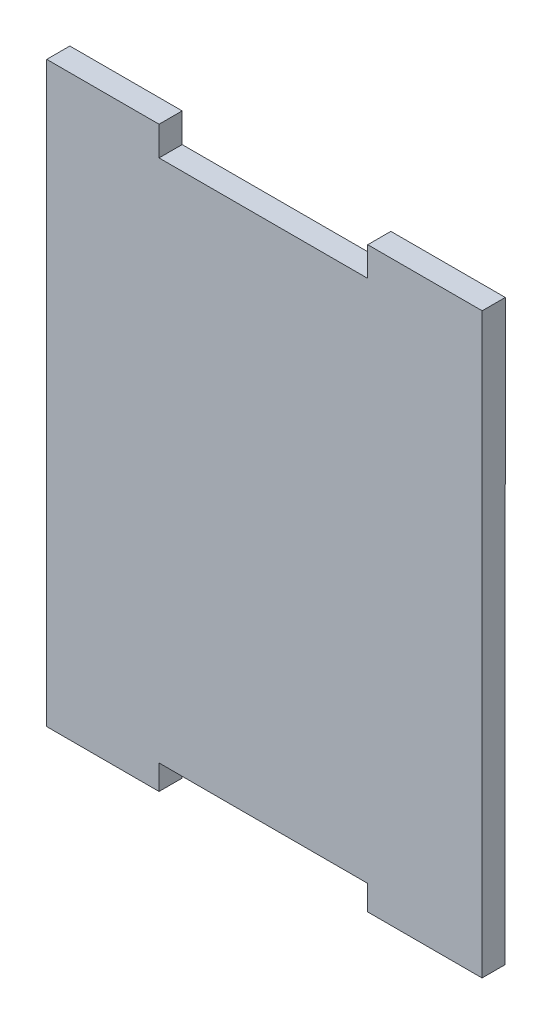
ISO-10303-21;
HEADER;
FILE_DESCRIPTION(('STEP AP214'),'2;1');
FILE_NAME('part.step','',(''),(''),'','','');
FILE_SCHEMA(('AUTOMOTIVE_DESIGN { 1 0 10303 214 1 1 1 1 }'));
ENDSEC;
DATA;
#1=APPLICATION_CONTEXT('core data for automotive mechanical design processes');
#2=APPLICATION_PROTOCOL_DEFINITION('international standard','automotive_design',2000,#1);
#3=PRODUCT_CONTEXT('',#1,'mechanical');
#4=PRODUCT('Part','Part','',(#3));
#5=PRODUCT_RELATED_PRODUCT_CATEGORY('part','',(#4));
#6=PRODUCT_DEFINITION_FORMATION('','',#4);
#7=PRODUCT_DEFINITION_CONTEXT('part definition',#1,'design');
#8=PRODUCT_DEFINITION('design','',#6,#7);
#9=PRODUCT_DEFINITION_SHAPE('','',#8);
#10=(LENGTH_UNIT() NAMED_UNIT(*) SI_UNIT(.MILLI.,.METRE.));
#11=(NAMED_UNIT(*) PLANE_ANGLE_UNIT() SI_UNIT($,.RADIAN.));
#12=(NAMED_UNIT(*) SI_UNIT($,.STERADIAN.) SOLID_ANGLE_UNIT());
#13=UNCERTAINTY_MEASURE_WITH_UNIT(LENGTH_MEASURE(1.E-05),#10,'distance_accuracy_value','');
#14=(GEOMETRIC_REPRESENTATION_CONTEXT(3) GLOBAL_UNCERTAINTY_ASSIGNED_CONTEXT((#13)) GLOBAL_UNIT_ASSIGNED_CONTEXT((#10,
#11,#12)) REPRESENTATION_CONTEXT('',''));
#15=CARTESIAN_POINT('',(0.,0.,0.));
#16=DIRECTION('',(0.,0.,1.));
#17=DIRECTION('',(1.,0.,0.));
#18=AXIS2_PLACEMENT_3D('',#15,#16,#17);
#19=CARTESIAN_POINT('',(286.293052740377,175.473191516554,3.));
#20=DIRECTION('',(1.,0.,0.));
#21=DIRECTION('',(0.,0.,-1.));
#22=AXIS2_PLACEMENT_3D('',#19,#20,#21);
#23=PLANE('',#22);
#24=DIRECTION('',(0.,-1.,0.));
#25=VECTOR('',#24,1.);
#26=CARTESIAN_POINT('',(286.293052740377,175.473191516554,0.));
#27=LINE('',#26,#25);
#28=CARTESIAN_POINT('',(286.293052740377,175.473191516554,0.));
#29=VERTEX_POINT('',#28);
#30=CARTESIAN_POINT('',(286.293052740377,100.473191220008,0.));
#31=VERTEX_POINT('',#30);
#32=EDGE_CURVE('E165',#29,#31,#27,.T.);
#33=ORIENTED_EDGE('',*,*,#32,.T.);
#34=DIRECTION('',(0.,0.,-1.));
#35=VECTOR('',#34,1.);
#36=CARTESIAN_POINT('',(286.293052740377,100.473191220008,3.));
#37=LINE('',#36,#35);
#38=CARTESIAN_POINT('',(286.293052740377,100.473191220008,3.));
#39=VERTEX_POINT('',#38);
#40=EDGE_CURVE('E11',#39,#31,#37,.T.);
#41=ORIENTED_EDGE('',*,*,#40,.F.);
#42=DIRECTION('',(0.,-1.,0.));
#43=VECTOR('',#42,1.);
#44=CARTESIAN_POINT('',(286.293052740377,175.473191516554,3.));
#45=LINE('',#44,#43);
#46=CARTESIAN_POINT('',(286.293052740377,175.473191516554,3.));
#47=VERTEX_POINT('',#46);
#48=EDGE_CURVE('E107',#47,#39,#45,.T.);
#49=ORIENTED_EDGE('',*,*,#48,.F.);
#50=DIRECTION('',(0.,0.,-1.));
#51=VECTOR('',#50,1.);
#52=CARTESIAN_POINT('',(286.293052740377,175.473191516554,3.));
#53=LINE('',#52,#51);
#54=EDGE_CURVE('E58',#47,#29,#53,.T.);
#55=ORIENTED_EDGE('',*,*,#54,.T.);
#56=EDGE_LOOP('',(#33,#41,#49,#55));
#57=FACE_BOUND('',#56,.T.);
#58=ADVANCED_FACE('F41',(#57),#23,.F.);
#59=CARTESIAN_POINT('',(300.871605208173,100.471894803693,3.));
#60=DIRECTION('',(-8.8926271188339E-05,-0.999999996046059,0.));
#61=DIRECTION('',(0.999999996046059,-8.8926271188339E-05,0.));
#62=AXIS2_PLACEMENT_3D('',#59,#60,#61);
#63=PLANE('',#62);
#64=DIRECTION('',(-0.999999996046059,8.8926271188339E-05,0.));
#65=VECTOR('',#64,1.);
#66=CARTESIAN_POINT('',(300.871605208173,100.471894803693,0.));
#67=LINE('',#66,#65);
#68=CARTESIAN_POINT('',(300.871605208173,100.471894803693,0.));
#69=VERTEX_POINT('',#68);
#70=EDGE_CURVE('E168',#69,#31,#67,.T.);
#71=ORIENTED_EDGE('',*,*,#70,.F.);
#72=DIRECTION('',(0.,0.,-1.));
#73=VECTOR('',#72,1.);
#74=CARTESIAN_POINT('',(300.871605208173,100.471894803693,3.));
#75=LINE('',#74,#73);
#76=CARTESIAN_POINT('',(300.871605208173,100.471894803693,3.));
#77=VERTEX_POINT('',#76);
#78=EDGE_CURVE('E50',#77,#69,#75,.T.);
#79=ORIENTED_EDGE('',*,*,#78,.F.);
#80=DIRECTION('',(-0.999999996046059,8.8926271188339E-05,0.));
#81=VECTOR('',#80,1.);
#82=CARTESIAN_POINT('',(300.871605208173,100.471894803693,3.));
#83=LINE('',#82,#81);
#84=EDGE_CURVE('E254',#77,#39,#83,.T.);
#85=ORIENTED_EDGE('',*,*,#84,.T.);
#86=ORIENTED_EDGE('',*,*,#40,.T.);
#87=EDGE_LOOP('',(#71,#79,#85,#86));
#88=FACE_BOUND('',#87,.T.);
#89=ADVANCED_FACE('F242',(#88),#63,.T.);
#90=CARTESIAN_POINT('',(300.872358522715,103.681894958134,3.));
#91=DIRECTION('',(0.999999972463256,-0.000234677409841452,0.));
#92=DIRECTION('',(0.000234677409841452,0.999999972463256,0.));
#93=AXIS2_PLACEMENT_3D('',#90,#91,#92);
#94=PLANE('',#93);
#95=DIRECTION('',(-0.000234677409841452,-0.999999972463256,0.));
#96=VECTOR('',#95,1.);
#97=CARTESIAN_POINT('',(300.872358522715,103.681894958134,0.));
#98=LINE('',#97,#96);
#99=CARTESIAN_POINT('',(300.872358522715,103.681894958134,0.));
#100=VERTEX_POINT('',#99);
#101=EDGE_CURVE('E172',#100,#69,#98,.T.);
#102=ORIENTED_EDGE('',*,*,#101,.F.);
#103=DIRECTION('',(0.,0.,-1.));
#104=VECTOR('',#103,1.);
#105=CARTESIAN_POINT('',(300.872358522715,103.681894958134,3.));
#106=LINE('',#105,#104);
#107=CARTESIAN_POINT('',(300.872358522715,103.681894958134,3.));
#108=VERTEX_POINT('',#107);
#109=EDGE_CURVE('E230',#108,#100,#106,.T.);
#110=ORIENTED_EDGE('',*,*,#109,.F.);
#111=DIRECTION('',(-0.000234677409841452,-0.999999972463256,0.));
#112=VECTOR('',#111,1.);
#113=CARTESIAN_POINT('',(300.872358522715,103.681894958134,3.));
#114=LINE('',#113,#112);
#115=EDGE_CURVE('E239',#108,#77,#114,.T.);
#116=ORIENTED_EDGE('',*,*,#115,.T.);
#117=ORIENTED_EDGE('',*,*,#78,.T.);
#118=EDGE_LOOP('',(#102,#110,#116,#117));
#119=FACE_BOUND('',#118,.T.);
#120=ADVANCED_FACE('F237',(#119),#94,.T.);
#121=CARTESIAN_POINT('',(327.943980392191,103.681896334188,3.));
#122=DIRECTION('',(5.08301229497291E-08,-0.999999999999999,0.));
#123=DIRECTION('',(0.999999999999999,5.08301229497292E-08,0.));
#124=AXIS2_PLACEMENT_3D('',#121,#122,#123);
#125=PLANE('',#124);
#126=DIRECTION('',(-0.999999999999999,-5.08301229497292E-08,0.));
#127=VECTOR('',#126,1.);
#128=CARTESIAN_POINT('',(327.943980392191,103.681896334188,0.));
#129=LINE('',#128,#127);
#130=CARTESIAN_POINT('',(327.943980392191,103.681896334188,0.));
#131=VERTEX_POINT('',#130);
#132=EDGE_CURVE('E176',#131,#100,#129,.T.);
#133=ORIENTED_EDGE('',*,*,#132,.F.);
#134=DIRECTION('',(0.,0.,-1.));
#135=VECTOR('',#134,1.);
#136=CARTESIAN_POINT('',(327.943980392191,103.681896334188,3.));
#137=LINE('',#136,#135);
#138=CARTESIAN_POINT('',(327.943980392191,103.681896334188,3.));
#139=VERTEX_POINT('',#138);
#140=EDGE_CURVE('E227',#139,#131,#137,.T.);
#141=ORIENTED_EDGE('',*,*,#140,.F.);
#142=DIRECTION('',(-0.999999999999999,-5.08301229497292E-08,0.));
#143=VECTOR('',#142,1.);
#144=CARTESIAN_POINT('',(327.943980392191,103.681896334188,3.));
#145=LINE('',#144,#143);
#146=EDGE_CURVE('E251',#139,#108,#145,.T.);
#147=ORIENTED_EDGE('',*,*,#146,.T.);
#148=ORIENTED_EDGE('',*,*,#109,.T.);
#149=EDGE_LOOP('',(#133,#141,#147,#148));
#150=FACE_BOUND('',#149,.T.);
#151=ADVANCED_FACE('F248',(#150),#125,.T.);
#152=CARTESIAN_POINT('',(327.943649556968,100.471909954446,3.));
#153=DIRECTION('',(-0.999999994688868,0.000103064369383968,0.));
#154=DIRECTION('',(-0.000103064369383968,-0.999999994688868,0.));
#155=AXIS2_PLACEMENT_3D('',#152,#153,#154);
#156=PLANE('',#155);
#157=DIRECTION('',(0.000103064369383968,0.999999994688868,0.));
#158=VECTOR('',#157,1.);
#159=CARTESIAN_POINT('',(327.943649556968,100.471909954446,0.));
#160=LINE('',#159,#158);
#161=CARTESIAN_POINT('',(327.943649556968,100.471909954446,0.));
#162=VERTEX_POINT('',#161);
#163=EDGE_CURVE('E180',#162,#131,#160,.T.);
#164=ORIENTED_EDGE('',*,*,#163,.F.);
#165=DIRECTION('',(0.,0.,-1.));
#166=VECTOR('',#165,1.);
#167=CARTESIAN_POINT('',(327.943649556968,100.471909954446,3.));
#168=LINE('',#167,#166);
#169=CARTESIAN_POINT('',(327.943649556968,100.471909954446,3.));
#170=VERTEX_POINT('',#169);
#171=EDGE_CURVE('E224',#170,#162,#168,.T.);
#172=ORIENTED_EDGE('',*,*,#171,.F.);
#173=DIRECTION('',(0.000103064369383968,0.999999994688868,0.));
#174=VECTOR('',#173,1.);
#175=CARTESIAN_POINT('',(327.943649556968,100.471909954446,3.));
#176=LINE('',#175,#174);
#177=EDGE_CURVE('E259',#170,#139,#176,.T.);
#178=ORIENTED_EDGE('',*,*,#177,.T.);
#179=ORIENTED_EDGE('',*,*,#140,.T.);
#180=EDGE_LOOP('',(#164,#172,#178,#179));
#181=FACE_BOUND('',#180,.T.);
#182=ADVANCED_FACE('F304',(#181),#156,.T.);
#183=CARTESIAN_POINT('',(342.793052670343,100.470378050132,3.));
#184=DIRECTION('',(-0.000103162685641328,-0.99999999467873,0.));
#185=DIRECTION('',(0.99999999467873,-0.000103162685641328,0.));
#186=AXIS2_PLACEMENT_3D('',#183,#184,#185);
#187=PLANE('',#186);
#188=DIRECTION('',(-0.99999999467873,0.000103162685641328,0.));
#189=VECTOR('',#188,1.);
#190=CARTESIAN_POINT('',(342.793052670343,100.470378050132,0.));
#191=LINE('',#190,#189);
#192=CARTESIAN_POINT('',(342.793052670343,100.470378050132,0.));
#193=VERTEX_POINT('',#192);
#194=EDGE_CURVE('E184',#193,#162,#191,.T.);
#195=ORIENTED_EDGE('',*,*,#194,.F.);
#196=DIRECTION('',(0.,0.,-1.));
#197=VECTOR('',#196,1.);
#198=CARTESIAN_POINT('',(342.793052670343,100.470378050132,3.));
#199=LINE('',#198,#197);
#200=CARTESIAN_POINT('',(342.793052670343,100.470378050132,3.));
#201=VERTEX_POINT('',#200);
#202=EDGE_CURVE('E221',#201,#193,#199,.T.);
#203=ORIENTED_EDGE('',*,*,#202,.F.);
#204=DIRECTION('',(-0.99999999467873,0.000103162685641328,0.));
#205=VECTOR('',#204,1.);
#206=CARTESIAN_POINT('',(342.793052670343,100.470378050132,3.));
#207=LINE('',#206,#205);
#208=EDGE_CURVE('E266',#201,#170,#207,.T.);
#209=ORIENTED_EDGE('',*,*,#208,.T.);
#210=ORIENTED_EDGE('',*,*,#171,.T.);
#211=EDGE_LOOP('',(#195,#203,#209,#210));
#212=FACE_BOUND('',#211,.T.);
#213=ADVANCED_FACE('F307',(#212),#187,.T.);
#214=CARTESIAN_POINT('',(342.806002993524,175.470377228605,3.));
#215=DIRECTION('',(0.999999985092367,-0.00017267097506607,0.));
#216=DIRECTION('',(0.00017267097506607,0.999999985092367,0.));
#217=AXIS2_PLACEMENT_3D('',#214,#215,#216);
#218=PLANE('',#217);
#219=DIRECTION('',(-0.00017267097506607,-0.999999985092367,0.));
#220=VECTOR('',#219,1.);
#221=CARTESIAN_POINT('',(342.806002993524,175.470377228605,0.));
#222=LINE('',#221,#220);
#223=CARTESIAN_POINT('',(342.806002993524,175.470377228605,0.));
#224=VERTEX_POINT('',#223);
#225=EDGE_CURVE('E188',#224,#193,#222,.T.);
#226=ORIENTED_EDGE('',*,*,#225,.F.);
#227=DIRECTION('',(0.,0.,-1.));
#228=VECTOR('',#227,1.);
#229=CARTESIAN_POINT('',(342.806002993524,175.470377228605,3.));
#230=LINE('',#229,#228);
#231=CARTESIAN_POINT('',(342.806002993524,175.470377228605,3.));
#232=VERTEX_POINT('',#231);
#233=EDGE_CURVE('E218',#232,#224,#230,.T.);
#234=ORIENTED_EDGE('',*,*,#233,.F.);
#235=DIRECTION('',(-0.00017267097506607,-0.999999985092367,0.));
#236=VECTOR('',#235,1.);
#237=CARTESIAN_POINT('',(342.806002993524,175.470377228605,3.));
#238=LINE('',#237,#236);
#239=EDGE_CURVE('E270',#232,#201,#238,.T.);
#240=ORIENTED_EDGE('',*,*,#239,.T.);
#241=ORIENTED_EDGE('',*,*,#202,.T.);
#242=EDGE_LOOP('',(#226,#234,#240,#241));
#243=FACE_BOUND('',#242,.T.);
#244=ADVANCED_FACE('F311',(#243),#218,.T.);
#245=CARTESIAN_POINT('',(327.956599880149,175.471909132919,3.));
#246=DIRECTION('',(0.000103162685642263,0.99999999467873,0.));
#247=DIRECTION('',(-0.99999999467873,0.000103162685642263,0.));
#248=AXIS2_PLACEMENT_3D('',#245,#246,#247);
#249=PLANE('',#248);
#250=DIRECTION('',(0.99999999467873,-0.000103162685642263,0.));
#251=VECTOR('',#250,1.);
#252=CARTESIAN_POINT('',(327.956599880149,175.471909132919,0.));
#253=LINE('',#252,#251);
#254=CARTESIAN_POINT('',(327.956599880149,175.471909132919,0.));
#255=VERTEX_POINT('',#254);
#256=EDGE_CURVE('E192',#255,#224,#253,.T.);
#257=ORIENTED_EDGE('',*,*,#256,.F.);
#258=DIRECTION('',(0.,0.,-1.));
#259=VECTOR('',#258,1.);
#260=CARTESIAN_POINT('',(327.956599880149,175.471909132919,3.));
#261=LINE('',#260,#259);
#262=CARTESIAN_POINT('',(327.956599880149,175.471909132919,3.));
#263=VERTEX_POINT('',#262);
#264=EDGE_CURVE('E215',#263,#255,#261,.T.);
#265=ORIENTED_EDGE('',*,*,#264,.F.);
#266=DIRECTION('',(0.99999999467873,-0.000103162685642263,0.));
#267=VECTOR('',#266,1.);
#268=CARTESIAN_POINT('',(327.956599880149,175.471909132919,3.));
#269=LINE('',#268,#267);
#270=EDGE_CURVE('E274',#263,#232,#269,.T.);
#271=ORIENTED_EDGE('',*,*,#270,.T.);
#272=ORIENTED_EDGE('',*,*,#233,.T.);
#273=EDGE_LOOP('',(#257,#265,#271,#272));
#274=FACE_BOUND('',#273,.T.);
#275=ADVANCED_FACE('F315',(#274),#249,.T.);
#276=CARTESIAN_POINT('',(327.956209264917,171.681896810087,3.));
#277=DIRECTION('',(-0.999999994688868,0.000103064369389119,0.));
#278=DIRECTION('',(-0.000103064369389119,-0.999999994688868,0.));
#279=AXIS2_PLACEMENT_3D('',#276,#277,#278);
#280=PLANE('',#279);
#281=DIRECTION('',(0.000103064369389119,0.999999994688868,0.));
#282=VECTOR('',#281,1.);
#283=CARTESIAN_POINT('',(327.956209264917,171.681896810087,0.));
#284=LINE('',#283,#282);
#285=CARTESIAN_POINT('',(327.956209264917,171.681896810087,0.));
#286=VERTEX_POINT('',#285);
#287=EDGE_CURVE('E196',#286,#255,#284,.T.);
#288=ORIENTED_EDGE('',*,*,#287,.F.);
#289=DIRECTION('',(0.,0.,-1.));
#290=VECTOR('',#289,1.);
#291=CARTESIAN_POINT('',(327.956209264917,171.681896810087,3.));
#292=LINE('',#291,#290);
#293=CARTESIAN_POINT('',(327.956209264917,171.681896810087,3.));
#294=VERTEX_POINT('',#293);
#295=EDGE_CURVE('E146',#294,#286,#292,.T.);
#296=ORIENTED_EDGE('',*,*,#295,.F.);
#297=DIRECTION('',(0.000103064369389119,0.999999994688868,0.));
#298=VECTOR('',#297,1.);
#299=CARTESIAN_POINT('',(327.956209264917,171.681896810087,3.));
#300=LINE('',#299,#298);
#301=EDGE_CURVE('E154',#294,#263,#300,.T.);
#302=ORIENTED_EDGE('',*,*,#301,.T.);
#303=ORIENTED_EDGE('',*,*,#264,.T.);
#304=EDGE_LOOP('',(#288,#296,#302,#303));
#305=FACE_BOUND('',#304,.T.);
#306=ADVANCED_FACE('F280',(#305),#280,.T.);
#307=CARTESIAN_POINT('',(300.870715780843,171.681895433328,3.));
#308=DIRECTION('',(-5.0830122687214E-08,0.999999999999999,0.));
#309=DIRECTION('',(-0.999999999999999,-5.0830122687214E-08,0.));
#310=AXIS2_PLACEMENT_3D('',#307,#308,#309);
#311=PLANE('',#310);
#312=DIRECTION('',(0.999999999999999,5.0830122687214E-08,0.));
#313=VECTOR('',#312,1.);
#314=CARTESIAN_POINT('',(300.870715780843,171.681895433328,0.));
#315=LINE('',#314,#313);
#316=CARTESIAN_POINT('',(300.870715780843,171.681895433328,0.));
#317=VERTEX_POINT('',#316);
#318=EDGE_CURVE('E141',#317,#286,#315,.T.);
#319=ORIENTED_EDGE('',*,*,#318,.F.);
#320=DIRECTION('',(0.,0.,-1.));
#321=VECTOR('',#320,1.);
#322=CARTESIAN_POINT('',(300.870715780843,171.681895433328,3.));
#323=LINE('',#322,#321);
#324=CARTESIAN_POINT('',(300.870715780843,171.681895433328,3.));
#325=VERTEX_POINT('',#324);
#326=EDGE_CURVE('E136',#325,#317,#323,.T.);
#327=ORIENTED_EDGE('',*,*,#326,.F.);
#328=DIRECTION('',(0.999999999999999,5.0830122687214E-08,0.));
#329=VECTOR('',#328,1.);
#330=CARTESIAN_POINT('',(300.870715780843,171.681895433328,3.));
#331=LINE('',#330,#329);
#332=EDGE_CURVE('E139',#325,#294,#331,.T.);
#333=ORIENTED_EDGE('',*,*,#332,.T.);
#334=ORIENTED_EDGE('',*,*,#295,.T.);
#335=EDGE_LOOP('',(#319,#327,#333,#334));
#336=FACE_BOUND('',#335,.T.);
#337=ADVANCED_FACE('F138',(#336),#311,.T.);
#338=CARTESIAN_POINT('',(300.871605208173,175.471895100239,3.));
#339=DIRECTION('',(0.999999972463256,-0.000234677409840807,0.));
#340=DIRECTION('',(0.000234677409840807,0.999999972463256,0.));
#341=AXIS2_PLACEMENT_3D('',#338,#339,#340);
#342=PLANE('',#341);
#343=DIRECTION('',(-0.000234677409840807,-0.999999972463256,0.));
#344=VECTOR('',#343,1.);
#345=CARTESIAN_POINT('',(300.871605208173,175.471895100239,0.));
#346=LINE('',#345,#344);
#347=CARTESIAN_POINT('',(300.871605208173,175.471895100239,0.));
#348=VERTEX_POINT('',#347);
#349=EDGE_CURVE('E202',#348,#317,#346,.T.);
#350=ORIENTED_EDGE('',*,*,#349,.F.);
#351=DIRECTION('',(0.,0.,-1.));
#352=VECTOR('',#351,1.);
#353=CARTESIAN_POINT('',(300.871605208173,175.471895100239,3.));
#354=LINE('',#353,#352);
#355=CARTESIAN_POINT('',(300.871605208173,175.471895100239,3.));
#356=VERTEX_POINT('',#355);
#357=EDGE_CURVE('E95',#356,#348,#354,.T.);
#358=ORIENTED_EDGE('',*,*,#357,.F.);
#359=DIRECTION('',(-0.000234677409840807,-0.999999972463256,0.));
#360=VECTOR('',#359,1.);
#361=CARTESIAN_POINT('',(300.871605208173,175.471895100239,3.));
#362=LINE('',#361,#360);
#363=EDGE_CURVE('E151',#356,#325,#362,.T.);
#364=ORIENTED_EDGE('',*,*,#363,.T.);
#365=ORIENTED_EDGE('',*,*,#326,.T.);
#366=EDGE_LOOP('',(#350,#358,#364,#365));
#367=FACE_BOUND('',#366,.T.);
#368=ADVANCED_FACE('F157',(#367),#342,.T.);
#369=CARTESIAN_POINT('',(286.293052740377,175.473191516554,3.));
#370=DIRECTION('',(8.8926271188339E-05,0.999999996046059,0.));
#371=DIRECTION('',(-0.999999996046059,8.8926271188339E-05,0.));
#372=AXIS2_PLACEMENT_3D('',#369,#370,#371);
#373=PLANE('',#372);
#374=DIRECTION('',(0.999999996046059,-8.8926271188339E-05,0.));
#375=VECTOR('',#374,1.);
#376=CARTESIAN_POINT('',(286.293052740377,175.473191516554,0.));
#377=LINE('',#376,#375);
#378=EDGE_CURVE('E205',#29,#348,#377,.T.);
#379=ORIENTED_EDGE('',*,*,#378,.F.);
#380=ORIENTED_EDGE('',*,*,#54,.F.);
#381=DIRECTION('',(0.999999996046059,-8.8926271188339E-05,0.));
#382=VECTOR('',#381,1.);
#383=CARTESIAN_POINT('',(286.293052740377,175.473191516554,3.));
#384=LINE('',#383,#382);
#385=EDGE_CURVE('E159',#47,#356,#384,.T.);
#386=ORIENTED_EDGE('',*,*,#385,.T.);
#387=ORIENTED_EDGE('',*,*,#357,.T.);
#388=EDGE_LOOP('',(#379,#380,#386,#387));
#389=FACE_BOUND('',#388,.T.);
#390=ADVANCED_FACE('F282',(#389),#373,.T.);
#391=CARTESIAN_POINT('',(0.,0.,3.));
#392=DIRECTION('',(0.,0.,-1.));
#393=DIRECTION('',(-1.,0.,0.));
#394=AXIS2_PLACEMENT_3D('',#391,#392,#393);
#395=PLANE('',#394);
#396=ORIENTED_EDGE('',*,*,#48,.T.);
#397=ORIENTED_EDGE('',*,*,#84,.F.);
#398=ORIENTED_EDGE('',*,*,#115,.F.);
#399=ORIENTED_EDGE('',*,*,#146,.F.);
#400=ORIENTED_EDGE('',*,*,#177,.F.);
#401=ORIENTED_EDGE('',*,*,#208,.F.);
#402=ORIENTED_EDGE('',*,*,#239,.F.);
#403=ORIENTED_EDGE('',*,*,#270,.F.);
#404=ORIENTED_EDGE('',*,*,#301,.F.);
#405=ORIENTED_EDGE('',*,*,#332,.F.);
#406=ORIENTED_EDGE('',*,*,#363,.F.);
#407=ORIENTED_EDGE('',*,*,#385,.F.);
#408=EDGE_LOOP('',(#396,#397,#398,#399,#400,#401,#402,#403,#404,#405,#406,#407));
#409=FACE_BOUND('',#408,.T.);
#410=ADVANCED_FACE('F150',(#409),#395,.F.);
#411=CARTESIAN_POINT('',(0.,0.,0.));
#412=DIRECTION('',(0.,0.,-1.));
#413=DIRECTION('',(-1.,0.,0.));
#414=AXIS2_PLACEMENT_3D('',#411,#412,#413);
#415=PLANE('',#414);
#416=ORIENTED_EDGE('',*,*,#32,.F.);
#417=ORIENTED_EDGE('',*,*,#378,.T.);
#418=ORIENTED_EDGE('',*,*,#349,.T.);
#419=ORIENTED_EDGE('',*,*,#318,.T.);
#420=ORIENTED_EDGE('',*,*,#287,.T.);
#421=ORIENTED_EDGE('',*,*,#256,.T.);
#422=ORIENTED_EDGE('',*,*,#225,.T.);
#423=ORIENTED_EDGE('',*,*,#194,.T.);
#424=ORIENTED_EDGE('',*,*,#163,.T.);
#425=ORIENTED_EDGE('',*,*,#132,.T.);
#426=ORIENTED_EDGE('',*,*,#101,.T.);
#427=ORIENTED_EDGE('',*,*,#70,.T.);
#428=EDGE_LOOP('',(#416,#417,#418,#419,#420,#421,#422,#423,#424,#425,#426,#427));
#429=FACE_BOUND('',#428,.T.);
#430=ADVANCED_FACE('F244',(#429),#415,.T.);
#431=CLOSED_SHELL('',(#58,#89,#120,#151,#182,#213,#244,#275,#306,#337,#368,#390,#410,#430));
#432=MANIFOLD_SOLID_BREP('B2',#431);
#433=ADVANCED_BREP_SHAPE_REPRESENTATION('',(#18,#432),#14);
#434=SHAPE_DEFINITION_REPRESENTATION(#9,#433);
ENDSEC;
END-ISO-10303-21;
